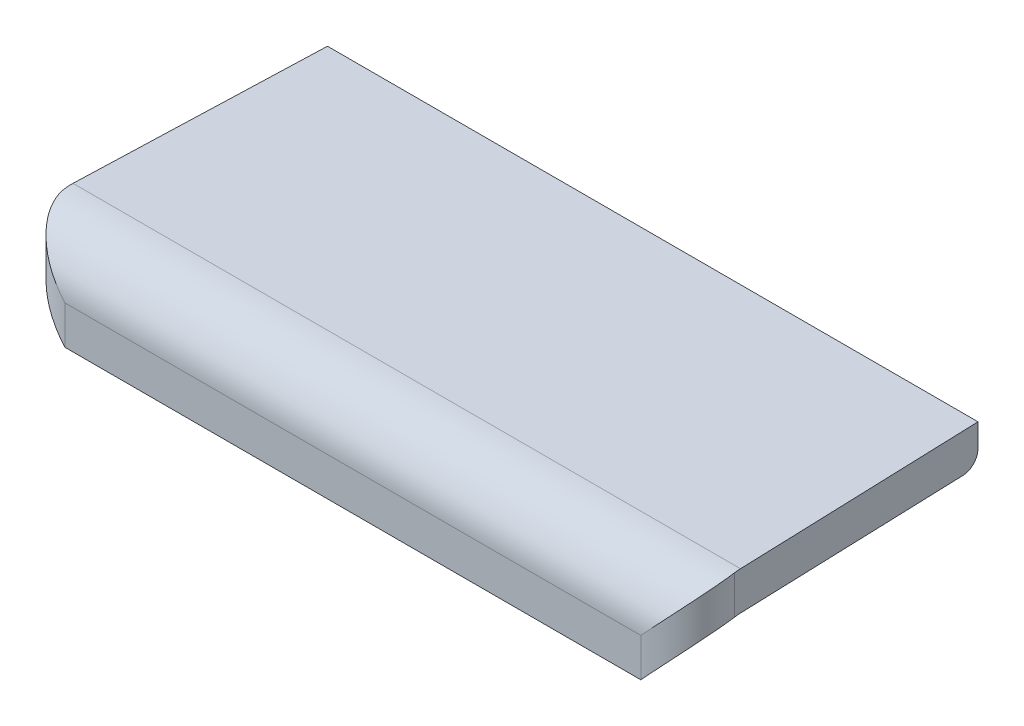
ISO-10303-21;
HEADER;
FILE_DESCRIPTION(('STEP AP214'),'2;1');
FILE_NAME('part.step','',(''),(''),'','','');
FILE_SCHEMA(('AUTOMOTIVE_DESIGN { 1 0 10303 214 1 1 1 1 }'));
ENDSEC;
DATA;
#1=APPLICATION_CONTEXT('core data for automotive mechanical design processes');
#2=APPLICATION_PROTOCOL_DEFINITION('international standard','automotive_design',2000,#1);
#3=PRODUCT_CONTEXT('',#1,'mechanical');
#4=PRODUCT('Part','Part','',(#3));
#5=PRODUCT_RELATED_PRODUCT_CATEGORY('part','',(#4));
#6=PRODUCT_DEFINITION_FORMATION('','',#4);
#7=PRODUCT_DEFINITION_CONTEXT('part definition',#1,'design');
#8=PRODUCT_DEFINITION('design','',#6,#7);
#9=PRODUCT_DEFINITION_SHAPE('','',#8);
#10=(LENGTH_UNIT() NAMED_UNIT(*) SI_UNIT(.MILLI.,.METRE.));
#11=(NAMED_UNIT(*) PLANE_ANGLE_UNIT() SI_UNIT($,.RADIAN.));
#12=(NAMED_UNIT(*) SI_UNIT($,.STERADIAN.) SOLID_ANGLE_UNIT());
#13=UNCERTAINTY_MEASURE_WITH_UNIT(LENGTH_MEASURE(1.E-05),#10,'distance_accuracy_value','');
#14=(GEOMETRIC_REPRESENTATION_CONTEXT(3) GLOBAL_UNCERTAINTY_ASSIGNED_CONTEXT((#13)) GLOBAL_UNIT_ASSIGNED_CONTEXT((#10,
#11,#12)) REPRESENTATION_CONTEXT('',''));
#15=CARTESIAN_POINT('',(0.,0.,0.));
#16=DIRECTION('',(0.,0.,1.));
#17=DIRECTION('',(1.,0.,0.));
#18=AXIS2_PLACEMENT_3D('',#15,#16,#17);
#19=CARTESIAN_POINT('',(22.,-2.5,49.5));
#20=DIRECTION('',(0.,1.,0.));
#21=DIRECTION('',(0.,0.,1.));
#22=AXIS2_PLACEMENT_3D('',#19,#20,#21);
#23=PLANE('',#22);
#24=DIRECTION('',(-0.0344622758397788,0.,0.999405999353588));
#25=VECTOR('',#24,1.);
#26=CARTESIAN_POINT('',(-21.6549881235154,-2.5,47.9946555819477));
#27=LINE('',#26,#25);
#28=CARTESIAN_POINT('',(-21.1896551724138,-2.5,34.5));
#29=VERTEX_POINT('',#28);
#30=CARTESIAN_POINT('',(-21.7068965517241,-2.5,49.5));
#31=VERTEX_POINT('',#30);
#32=EDGE_CURVE('E239',#29,#31,#27,.T.);
#33=ORIENTED_EDGE('',*,*,#32,.F.);
#34=DIRECTION('',(-1.,0.,0.));
#35=VECTOR('',#34,1.);
#36=CARTESIAN_POINT('',(21.1551724137931,-2.5,34.5));
#37=LINE('',#36,#35);
#38=CARTESIAN_POINT('',(21.1896551724138,-2.5,34.5));
#39=VERTEX_POINT('',#38);
#40=EDGE_CURVE('E47',#29,#39,#37,.F.);
#41=ORIENTED_EDGE('',*,*,#40,.T.);
#42=DIRECTION('',(-0.0344622758397784,0.,-0.999405999353588));
#43=VECTOR('',#42,1.);
#44=CARTESIAN_POINT('',(21.7072446555819,-2.5,49.5100950118765));
#45=LINE('',#44,#43);
#46=CARTESIAN_POINT('',(21.7068965517241,-2.5,49.5));
#47=VERTEX_POINT('',#46);
#48=EDGE_CURVE('E235',#47,#39,#45,.T.);
#49=ORIENTED_EDGE('',*,*,#48,.F.);
#50=DIRECTION('',(-1.,0.,0.));
#51=VECTOR('',#50,1.);
#52=CARTESIAN_POINT('',(22.,-2.5,49.5));
#53=LINE('',#52,#51);
#54=EDGE_CURVE('E311',#47,#31,#53,.T.);
#55=ORIENTED_EDGE('',*,*,#54,.T.);
#56=EDGE_LOOP('',(#33,#41,#49,#55));
#57=FACE_BOUND('',#56,.T.);
#58=DIRECTION('',(-1.,0.,0.));
#59=VECTOR('',#58,1.);
#60=CARTESIAN_POINT('',(10.,-2.5,41.));
#61=LINE('',#60,#59);
#62=CARTESIAN_POINT('',(10.,-2.5,41.));
#63=VERTEX_POINT('',#62);
#64=CARTESIAN_POINT('',(-10.,-2.5,41.));
#65=VERTEX_POINT('',#64);
#66=EDGE_CURVE('E59',#63,#65,#61,.T.);
#67=ORIENTED_EDGE('',*,*,#66,.T.);
#68=DIRECTION('',(0.,0.,1.));
#69=VECTOR('',#68,1.);
#70=CARTESIAN_POINT('',(-10.,-2.5,47.));
#71=LINE('',#70,#69);
#72=CARTESIAN_POINT('',(-10.,-2.5,47.));
#73=VERTEX_POINT('',#72);
#74=EDGE_CURVE('E409',#65,#73,#71,.T.);
#75=ORIENTED_EDGE('',*,*,#74,.T.);
#76=DIRECTION('',(-1.,0.,0.));
#77=VECTOR('',#76,1.);
#78=CARTESIAN_POINT('',(10.,-2.5,47.));
#79=LINE('',#78,#77);
#80=CARTESIAN_POINT('',(10.,-2.5,47.));
#81=VERTEX_POINT('',#80);
#82=EDGE_CURVE('E158',#81,#73,#79,.T.);
#83=ORIENTED_EDGE('',*,*,#82,.F.);
#84=DIRECTION('',(0.,0.,1.));
#85=VECTOR('',#84,1.);
#86=CARTESIAN_POINT('',(10.,-2.5,47.));
#87=LINE('',#86,#85);
#88=EDGE_CURVE('E54',#63,#81,#87,.T.);
#89=ORIENTED_EDGE('',*,*,#88,.F.);
#90=EDGE_LOOP('',(#67,#75,#83,#89));
#91=FACE_BOUND('',#90,.T.);
#92=ADVANCED_FACE('F39',(#57,#91),#23,.F.);
#93=CARTESIAN_POINT('',(22.,0.,49.5));
#94=DIRECTION('',(0.,-1.,0.));
#95=DIRECTION('',(0.,0.,-1.));
#96=AXIS2_PLACEMENT_3D('',#93,#94,#95);
#97=PLANE('',#96);
#98=DIRECTION('',(-0.0344622758397788,0.,0.999405999353588));
#99=VECTOR('',#98,1.);
#100=CARTESIAN_POINT('',(-21.1551724137931,0.,33.5));
#101=LINE('',#100,#99);
#102=CARTESIAN_POINT('',(-21.1551724137931,0.,33.5));
#103=VERTEX_POINT('',#102);
#104=CARTESIAN_POINT('',(-21.7068965517241,0.,49.5));
#105=VERTEX_POINT('',#104);
#106=EDGE_CURVE('E153',#103,#105,#101,.T.);
#107=ORIENTED_EDGE('',*,*,#106,.T.);
#108=DIRECTION('',(-1.,0.,0.));
#109=VECTOR('',#108,1.);
#110=CARTESIAN_POINT('',(22.,0.,49.5));
#111=LINE('',#110,#109);
#112=CARTESIAN_POINT('',(21.7068965517241,0.,49.5));
#113=VERTEX_POINT('',#112);
#114=EDGE_CURVE('E227',#113,#105,#111,.T.);
#115=ORIENTED_EDGE('',*,*,#114,.F.);
#116=DIRECTION('',(-0.0344622758397783,0.,-0.999405999353587));
#117=VECTOR('',#116,1.);
#118=CARTESIAN_POINT('',(21.1551724137931,0.,33.5));
#119=LINE('',#118,#117);
#120=CARTESIAN_POINT('',(21.1551724137931,0.,33.5));
#121=VERTEX_POINT('',#120);
#122=EDGE_CURVE('E156',#113,#121,#119,.T.);
#123=ORIENTED_EDGE('',*,*,#122,.T.);
#124=DIRECTION('',(-1.,0.,0.));
#125=VECTOR('',#124,1.);
#126=CARTESIAN_POINT('',(21.1551724137931,0.,33.5));
#127=LINE('',#126,#125);
#128=EDGE_CURVE('E164',#121,#103,#127,.T.);
#129=ORIENTED_EDGE('',*,*,#128,.T.);
#130=EDGE_LOOP('',(#107,#115,#123,#129));
#131=FACE_BOUND('',#130,.T.);
#132=ADVANCED_FACE('F213',(#131),#97,.F.);
#133=CARTESIAN_POINT('',(22.,-3.5,49.5));
#134=DIRECTION('',(-1.,0.,0.));
#135=DIRECTION('',(0.,0.,1.));
#136=AXIS2_PLACEMENT_3D('',#133,#134,#135);
#137=CYLINDRICAL_SURFACE('',#136,3.5);
#138=CARTESIAN_POINT('',(21.7068965517241,-3.5,49.5));
#139=DIRECTION('',(0.999405999353587,0.,-0.0344622758397783));
#140=DIRECTION('',(-0.0344622758397784,0.,-0.999405999353588));
#141=AXIS2_PLACEMENT_3D('',#138,#139,#140);
#142=ELLIPSE('',#141,3.50208023792511,3.5);
#143=CARTESIAN_POINT('',(21.7205728680166,-0.0225443221494809,49.8966131724806));
#144=VERTEX_POINT('',#143);
#145=EDGE_CURVE('E184',#113,#144,#142,.T.);
#146=ORIENTED_EDGE('',*,*,#145,.F.);
#147=ORIENTED_EDGE('',*,*,#114,.T.);
#148=CARTESIAN_POINT('',(-21.7068965517241,-3.5,49.5));
#149=DIRECTION('',(-0.999405999353588,0.,-0.0344622758397788));
#150=DIRECTION('',(-0.0344622758397788,0.,0.999405999353588));
#151=AXIS2_PLACEMENT_3D('',#148,#149,#150);
#152=ELLIPSE('',#151,3.50208023792511,3.5);
#153=CARTESIAN_POINT('',(-21.7205728680166,-0.0225443221494809,49.8966131724806));
#154=VERTEX_POINT('',#153);
#155=EDGE_CURVE('E188',#154,#105,#152,.T.);
#156=ORIENTED_EDGE('',*,*,#155,.F.);
#157=CARTESIAN_POINT('',(-21.7205728680166,-0.02254432214948,49.8966131724806));
#158=CARTESIAN_POINT('',(-21.723099481034,-0.0308270597133825,49.969397073666));
#159=CARTESIAN_POINT('',(-21.7229330313787,-0.0414387192479934,50.041987850838));
#160=CARTESIAN_POINT('',(-21.7174394702517,-0.0671333761220668,50.1861088489311));
#161=CARTESIAN_POINT('',(-21.7121171874432,-0.0822121806130926,50.2576399986027));
#162=CARTESIAN_POINT('',(-21.6966091949185,-0.116520602392555,50.3984893759646));
#163=CARTESIAN_POINT('',(-21.6864662803325,-0.135712894634143,50.4678214575865));
#164=CARTESIAN_POINT('',(-21.661655743448,-0.178049488283337,50.6044301030989));
#165=CARTESIAN_POINT('',(-21.646987250324,-0.201194549911776,50.6717062686432));
#166=CARTESIAN_POINT('',(-21.5968349115689,-0.275927568086759,50.86934082527));
#167=CARTESIAN_POINT('',(-21.555129550973,-0.33297031202598,50.9961358180921));
#168=CARTESIAN_POINT('',(-21.4580603760784,-0.459018576141426,51.2381490307011));
#169=CARTESIAN_POINT('',(-21.4026638443881,-0.528052632424236,51.3533385753107));
#170=CARTESIAN_POINT('',(-21.2528586884497,-0.709752512866677,51.6216835421228));
#171=CARTESIAN_POINT('',(-21.1522613830579,-0.827823366149102,51.7677318255221));
#172=CARTESIAN_POINT('',(-20.9348601670666,-1.07807424786497,52.0333223695516));
#173=CARTESIAN_POINT('',(-20.8180229357625,-1.21028315240175,52.1528087864646));
#174=CARTESIAN_POINT('',(-20.6109347383381,-1.44211081639417,52.3336461236898));
#175=CARTESIAN_POINT('',(-20.5235409696902,-1.53926624250616,52.4015806718975));
#176=CARTESIAN_POINT('',(-20.3446055433532,-1.7371662512179,52.5259015111697));
#177=CARTESIAN_POINT('',(-20.253062142409,-1.83791233837881,52.5822828928154));
#178=CARTESIAN_POINT('',(-20.0668499652639,-2.04210009715241,52.6839502339347));
#179=CARTESIAN_POINT('',(-19.9721803089163,-2.14554252611969,52.7292330380376));
#180=CARTESIAN_POINT('',(-19.7805796142608,-2.35436331000505,52.8090793722104));
#181=CARTESIAN_POINT('',(-19.6836491987311,-2.4597411301139,52.8436458177092));
#182=CARTESIAN_POINT('',(-19.4453849311314,-2.7183221553345,52.9152650321936));
#183=CARTESIAN_POINT('',(-19.3031829147086,-2.87227322535515,52.9467857269257));
#184=CARTESIAN_POINT('',(-19.0174239625978,-3.1812858866879,52.9889370017869));
#185=CARTESIAN_POINT('',(-18.8738699166592,-3.3363449890341,52.9996049724396));
#186=CARTESIAN_POINT('',(-18.7277137537086,-3.49421174391062,52.9999964069314));
#187=CARTESIAN_POINT('',(-18.7250342954736,-3.49710588957766,52.9999999964529));
#188=CARTESIAN_POINT('',(-18.7223548699558,-3.5,53.));
#189=B_SPLINE_CURVE_WITH_KNOTS('',3,(#157,#158,#159,#160,#161,#162,#163,#164,#165,#166,#167,
#168,#169,#170,#171,#172,#173,#174,#175,#176,#177,#178,#179,#180,#181,#182,#183,#184,#185,#186,
#187,#188),.UNSPECIFIED.,.F.,.F.,(4,2,2,2,2,2,2,2,2,2,2,2,2,2,2,4),(0.,0.219774415698643,
0.439343201846454,0.656998174418557,0.874695054967472,1.30815197444715,1.74265490197855,
2.37828380269417,3.0152366711636,3.45654082170771,3.89803211353046,4.33964877790322,
4.78114519302685,5.41585364892529,6.04942297640999,6.0612551408771),.UNSPECIFIED.);
#190=CARTESIAN_POINT('',(-18.7223548699558,-3.5,53.));
#191=VERTEX_POINT('',#190);
#192=EDGE_CURVE('E190',#191,#154,#189,.F.);
#193=ORIENTED_EDGE('',*,*,#192,.F.);
#194=DIRECTION('',(-1.,0.,0.));
#195=VECTOR('',#194,1.);
#196=CARTESIAN_POINT('',(22.,-3.5,53.));
#197=LINE('',#196,#195);
#198=CARTESIAN_POINT('',(18.7223548699558,-3.5,53.));
#199=VERTEX_POINT('',#198);
#200=EDGE_CURVE('E236',#199,#191,#197,.T.);
#201=ORIENTED_EDGE('',*,*,#200,.F.);
#202=CARTESIAN_POINT('',(21.7205728680166,-0.02254432214948,49.8966131724806));
#203=CARTESIAN_POINT('',(21.723099481034,-0.0308270597133825,49.969397073666));
#204=CARTESIAN_POINT('',(21.7229330313787,-0.0414387192479934,50.041987850838));
#205=CARTESIAN_POINT('',(21.7174394702517,-0.0671333761220668,50.1861088489311));
#206=CARTESIAN_POINT('',(21.7121171874432,-0.0822121806130926,50.2576399986027));
#207=CARTESIAN_POINT('',(21.6966091949185,-0.116520602392555,50.3984893759646));
#208=CARTESIAN_POINT('',(21.6864662803325,-0.135712894634143,50.4678214575865));
#209=CARTESIAN_POINT('',(21.661655743448,-0.178049488283337,50.6044301030989));
#210=CARTESIAN_POINT('',(21.646987250324,-0.201194549911776,50.6717062686432));
#211=CARTESIAN_POINT('',(21.5968349115689,-0.275927568086759,50.86934082527));
#212=CARTESIAN_POINT('',(21.555129550973,-0.33297031202598,50.9961358180921));
#213=CARTESIAN_POINT('',(21.4580603760784,-0.459018576141426,51.2381490307011));
#214=CARTESIAN_POINT('',(21.4026638443881,-0.528052632424236,51.3533385753107));
#215=CARTESIAN_POINT('',(21.2528586884497,-0.709752512866677,51.6216835421228));
#216=CARTESIAN_POINT('',(21.1522613830579,-0.827823366149102,51.7677318255221));
#217=CARTESIAN_POINT('',(20.9348601670666,-1.07807424786497,52.0333223695516));
#218=CARTESIAN_POINT('',(20.8180229357625,-1.21028315240175,52.1528087864646));
#219=CARTESIAN_POINT('',(20.6109347383381,-1.44211081639417,52.3336461236898));
#220=CARTESIAN_POINT('',(20.5235409696902,-1.53926624250616,52.4015806718975));
#221=CARTESIAN_POINT('',(20.3446055433532,-1.7371662512179,52.5259015111697));
#222=CARTESIAN_POINT('',(20.253062142409,-1.83791233837881,52.5822828928154));
#223=CARTESIAN_POINT('',(20.0668499652639,-2.04210009715241,52.6839502339347));
#224=CARTESIAN_POINT('',(19.9721803089163,-2.14554252611969,52.7292330380376));
#225=CARTESIAN_POINT('',(19.7805796142608,-2.35436331000505,52.8090793722104));
#226=CARTESIAN_POINT('',(19.6836491987311,-2.4597411301139,52.8436458177092));
#227=CARTESIAN_POINT('',(19.4453849311314,-2.7183221553345,52.9152650321936));
#228=CARTESIAN_POINT('',(19.3031829147086,-2.87227322535515,52.9467857269257));
#229=CARTESIAN_POINT('',(19.0174239625978,-3.1812858866879,52.9889370017869));
#230=CARTESIAN_POINT('',(18.8738699166592,-3.3363449890341,52.9996049724396));
#231=CARTESIAN_POINT('',(18.7277137537086,-3.49421174391062,52.9999964069314));
#232=CARTESIAN_POINT('',(18.7250342954736,-3.49710588957766,52.9999999964529));
#233=CARTESIAN_POINT('',(18.7223548699558,-3.5,53.));
#234=B_SPLINE_CURVE_WITH_KNOTS('',3,(#202,#203,#204,#205,#206,#207,#208,#209,#210,#211,#212,
#213,#214,#215,#216,#217,#218,#219,#220,#221,#222,#223,#224,#225,#226,#227,#228,#229,#230,#231,
#232,#233),.UNSPECIFIED.,.F.,.F.,(4,2,2,2,2,2,2,2,2,2,2,2,2,2,2,4),(0.,0.219774415698643,
0.439343201846454,0.656998174418557,0.874695054967472,1.30815197444715,1.74265490197855,
2.37828380269417,3.0152366711636,3.45654082170771,3.89803211353046,4.33964877790322,
4.78114519302685,5.41585364892529,6.04942297640999,6.0612551408771),.UNSPECIFIED.);
#235=EDGE_CURVE('E198',#144,#199,#234,.T.);
#236=ORIENTED_EDGE('',*,*,#235,.F.);
#237=EDGE_LOOP('',(#146,#147,#156,#193,#201,#236));
#238=FACE_BOUND('',#237,.T.);
#239=ADVANCED_FACE('F208',(#238),#137,.T.);
#240=CARTESIAN_POINT('',(22.,-6.,53.));
#241=DIRECTION('',(0.,0.,-1.));
#242=DIRECTION('',(-1.,0.,0.));
#243=AXIS2_PLACEMENT_3D('',#240,#241,#242);
#244=PLANE('',#243);
#245=DIRECTION('',(-1.,0.,0.));
#246=VECTOR('',#245,1.);
#247=CARTESIAN_POINT('',(22.,-6.,53.));
#248=LINE('',#247,#246);
#249=CARTESIAN_POINT('',(18.7223548699558,-6.,53.));
#250=VERTEX_POINT('',#249);
#251=CARTESIAN_POINT('',(-18.7223548699558,-6.,53.));
#252=VERTEX_POINT('',#251);
#253=EDGE_CURVE('E242',#250,#252,#248,.T.);
#254=ORIENTED_EDGE('',*,*,#253,.F.);
#255=DIRECTION('',(0.,1.,0.));
#256=VECTOR('',#255,1.);
#257=CARTESIAN_POINT('',(18.7223548699558,-7.,53.));
#258=LINE('',#257,#256);
#259=EDGE_CURVE('E176',#250,#199,#258,.T.);
#260=ORIENTED_EDGE('',*,*,#259,.T.);
#261=ORIENTED_EDGE('',*,*,#200,.T.);
#262=DIRECTION('',(0.,1.,0.));
#263=VECTOR('',#262,1.);
#264=CARTESIAN_POINT('',(-18.7223548699558,-7.,53.));
#265=LINE('',#264,#263);
#266=EDGE_CURVE('E179',#252,#191,#265,.T.);
#267=ORIENTED_EDGE('',*,*,#266,.F.);
#268=EDGE_LOOP('',(#254,#260,#261,#267));
#269=FACE_BOUND('',#268,.T.);
#270=ADVANCED_FACE('F212',(#269),#244,.F.);
#271=CARTESIAN_POINT('',(22.,-6.,49.5));
#272=DIRECTION('',(-1.,0.,0.));
#273=DIRECTION('',(0.,0.,1.));
#274=AXIS2_PLACEMENT_3D('',#271,#272,#273);
#275=CYLINDRICAL_SURFACE('',#274,3.5);
#276=CARTESIAN_POINT('',(21.7068965517241,-6.,49.5));
#277=DIRECTION('',(0.999405999353587,0.,-0.0344622758397783));
#278=DIRECTION('',(-0.0344622758397784,0.,-0.999405999353588));
#279=AXIS2_PLACEMENT_3D('',#276,#277,#278);
#280=ELLIPSE('',#279,3.50208023792511,3.5);
#281=CARTESIAN_POINT('',(21.7205728680166,-2.52254432214948,49.8966131724806));
#282=VERTEX_POINT('',#281);
#283=EDGE_CURVE('E170',#282,#47,#280,.F.);
#284=ORIENTED_EDGE('',*,*,#283,.F.);
#285=CARTESIAN_POINT('',(21.7205728680166,-2.52254432214948,49.8966131724806));
#286=CARTESIAN_POINT('',(21.723099481034,-2.53082705971338,49.969397073666));
#287=CARTESIAN_POINT('',(21.7229330313787,-2.54143871924799,50.041987850838));
#288=CARTESIAN_POINT('',(21.7174394702517,-2.56713337612207,50.1861088489311));
#289=CARTESIAN_POINT('',(21.7121171874432,-2.58221218061309,50.2576399986027));
#290=CARTESIAN_POINT('',(21.6966091949185,-2.61652060239256,50.3984893759646));
#291=CARTESIAN_POINT('',(21.6864662803325,-2.63571289463414,50.4678214575865));
#292=CARTESIAN_POINT('',(21.661655743448,-2.67804948828334,50.6044301030989));
#293=CARTESIAN_POINT('',(21.646987250324,-2.70119454991178,50.6717062686432));
#294=CARTESIAN_POINT('',(21.5968349115689,-2.77592756808676,50.86934082527));
#295=CARTESIAN_POINT('',(21.555129550973,-2.83297031202598,50.9961358180921));
#296=CARTESIAN_POINT('',(21.4580603760784,-2.95901857614142,51.2381490307011));
#297=CARTESIAN_POINT('',(21.4026638443881,-3.02805263242423,51.3533385753107));
#298=CARTESIAN_POINT('',(21.2528586884497,-3.20975251286668,51.6216835421228));
#299=CARTESIAN_POINT('',(21.1522613830579,-3.32782336614911,51.7677318255221));
#300=CARTESIAN_POINT('',(20.9348601670666,-3.57807424786498,52.0333223695517));
#301=CARTESIAN_POINT('',(20.8180229357625,-3.71028315240176,52.1528087864646));
#302=CARTESIAN_POINT('',(20.6109347383381,-3.94211081639419,52.3336461236898));
#303=CARTESIAN_POINT('',(20.5235409696901,-4.03926624250617,52.4015806718975));
#304=CARTESIAN_POINT('',(20.3446055433532,-4.23716625121791,52.5259015111697));
#305=CARTESIAN_POINT('',(20.253062142409,-4.33791233837883,52.5822828928154));
#306=CARTESIAN_POINT('',(20.0668499652639,-4.54210009715242,52.6839502339347));
#307=CARTESIAN_POINT('',(19.9721803089163,-4.6455425261197,52.7292330380376));
#308=CARTESIAN_POINT('',(19.7805796142608,-4.85436331000506,52.8090793722104));
#309=CARTESIAN_POINT('',(19.6836491987311,-4.95974113011392,52.8436458177092));
#310=CARTESIAN_POINT('',(19.4453849311314,-5.21832215533451,52.9152650321936));
#311=CARTESIAN_POINT('',(19.3031829147086,-5.37227322535518,52.9467857269257));
#312=CARTESIAN_POINT('',(19.0174239625978,-5.68128588668789,52.9889370017869));
#313=CARTESIAN_POINT('',(18.8738699166591,-5.83634498903405,52.9996049724396));
#314=CARTESIAN_POINT('',(18.7277137537086,-5.99421174391062,52.9999964069314));
#315=CARTESIAN_POINT('',(18.7250342954736,-5.99710588957766,52.9999999964529));
#316=CARTESIAN_POINT('',(18.7223548699558,-6.,53.));
#317=B_SPLINE_CURVE_WITH_KNOTS('',3,(#285,#286,#287,#288,#289,#290,#291,#292,#293,#294,#295,
#296,#297,#298,#299,#300,#301,#302,#303,#304,#305,#306,#307,#308,#309,#310,#311,#312,#313,#314,
#315,#316),.UNSPECIFIED.,.F.,.F.,(4,2,2,2,2,2,2,2,2,2,2,2,2,2,2,4),(0.,0.219774415698643,
0.439343201846454,0.656998174418557,0.874695054967472,1.30815197444714,1.74265490197855,
2.37828380269418,3.01523667116362,3.45654082170773,3.89803211353048,4.33964877790324,
4.78114519302687,5.4158536489253,6.04942297640999,6.0612551408771),.UNSPECIFIED.);
#318=EDGE_CURVE('E253',#250,#282,#317,.F.);
#319=ORIENTED_EDGE('',*,*,#318,.F.);
#320=ORIENTED_EDGE('',*,*,#253,.T.);
#321=CARTESIAN_POINT('',(-21.7205728680166,-2.52254432214948,49.8966131724806));
#322=CARTESIAN_POINT('',(-21.723099481034,-2.53082705971338,49.969397073666));
#323=CARTESIAN_POINT('',(-21.7229330313787,-2.54143871924799,50.041987850838));
#324=CARTESIAN_POINT('',(-21.7174394702517,-2.56713337612207,50.1861088489311));
#325=CARTESIAN_POINT('',(-21.7121171874432,-2.58221218061309,50.2576399986027));
#326=CARTESIAN_POINT('',(-21.6966091949185,-2.61652060239256,50.3984893759646));
#327=CARTESIAN_POINT('',(-21.6864662803325,-2.63571289463414,50.4678214575865));
#328=CARTESIAN_POINT('',(-21.661655743448,-2.67804948828334,50.6044301030989));
#329=CARTESIAN_POINT('',(-21.646987250324,-2.70119454991178,50.6717062686432));
#330=CARTESIAN_POINT('',(-21.5968349115689,-2.77592756808676,50.86934082527));
#331=CARTESIAN_POINT('',(-21.555129550973,-2.83297031202598,50.9961358180921));
#332=CARTESIAN_POINT('',(-21.4580603760784,-2.95901857614142,51.2381490307011));
#333=CARTESIAN_POINT('',(-21.4026638443881,-3.02805263242423,51.3533385753107));
#334=CARTESIAN_POINT('',(-21.2528586884497,-3.20975251286668,51.6216835421228));
#335=CARTESIAN_POINT('',(-21.1522613830579,-3.32782336614911,51.7677318255221));
#336=CARTESIAN_POINT('',(-20.9348601670666,-3.57807424786498,52.0333223695517));
#337=CARTESIAN_POINT('',(-20.8180229357625,-3.71028315240176,52.1528087864646));
#338=CARTESIAN_POINT('',(-20.6109347383381,-3.94211081639419,52.3336461236898));
#339=CARTESIAN_POINT('',(-20.5235409696901,-4.03926624250617,52.4015806718975));
#340=CARTESIAN_POINT('',(-20.3446055433532,-4.23716625121791,52.5259015111697));
#341=CARTESIAN_POINT('',(-20.253062142409,-4.33791233837883,52.5822828928154));
#342=CARTESIAN_POINT('',(-20.0668499652639,-4.54210009715242,52.6839502339347));
#343=CARTESIAN_POINT('',(-19.9721803089163,-4.6455425261197,52.7292330380376));
#344=CARTESIAN_POINT('',(-19.7805796142608,-4.85436331000506,52.8090793722104));
#345=CARTESIAN_POINT('',(-19.6836491987311,-4.95974113011392,52.8436458177092));
#346=CARTESIAN_POINT('',(-19.4453849311314,-5.21832215533451,52.9152650321936));
#347=CARTESIAN_POINT('',(-19.3031829147086,-5.37227322535518,52.9467857269257));
#348=CARTESIAN_POINT('',(-19.0174239625978,-5.68128588668789,52.9889370017869));
#349=CARTESIAN_POINT('',(-18.8738699166591,-5.83634498903405,52.9996049724396));
#350=CARTESIAN_POINT('',(-18.7277137537086,-5.99421174391062,52.9999964069314));
#351=CARTESIAN_POINT('',(-18.7250342954736,-5.99710588957766,52.9999999964529));
#352=CARTESIAN_POINT('',(-18.7223548699558,-6.,53.));
#353=B_SPLINE_CURVE_WITH_KNOTS('',3,(#321,#322,#323,#324,#325,#326,#327,#328,#329,#330,#331,
#332,#333,#334,#335,#336,#337,#338,#339,#340,#341,#342,#343,#344,#345,#346,#347,#348,#349,#350,
#351,#352),.UNSPECIFIED.,.F.,.F.,(4,2,2,2,2,2,2,2,2,2,2,2,2,2,2,4),(0.,0.219774415698643,
0.439343201846454,0.656998174418557,0.874695054967472,1.30815197444714,1.74265490197855,
2.37828380269418,3.01523667116362,3.45654082170773,3.89803211353048,4.33964877790324,
4.78114519302687,5.4158536489253,6.04942297640999,6.0612551408771),.UNSPECIFIED.);
#354=CARTESIAN_POINT('',(-21.7205728680166,-2.52254432214948,49.8966131724806));
#355=VERTEX_POINT('',#354);
#356=EDGE_CURVE('E247',#355,#252,#353,.T.);
#357=ORIENTED_EDGE('',*,*,#356,.F.);
#358=CARTESIAN_POINT('',(-21.7068965517241,-6.,49.5));
#359=DIRECTION('',(-0.999405999353588,0.,-0.0344622758397788));
#360=DIRECTION('',(-0.0344622758397788,0.,0.999405999353588));
#361=AXIS2_PLACEMENT_3D('',#358,#359,#360);
#362=ELLIPSE('',#361,3.50208023792511,3.5);
#363=EDGE_CURVE('E186',#31,#355,#362,.F.);
#364=ORIENTED_EDGE('',*,*,#363,.F.);
#365=ORIENTED_EDGE('',*,*,#54,.F.);
#366=EDGE_LOOP('',(#284,#319,#320,#357,#364,#365));
#367=FACE_BOUND('',#366,.T.);
#368=ADVANCED_FACE('F259',(#367),#275,.F.);
#369=CARTESIAN_POINT('',(18.7223548699558,-7.,50.));
#370=DIRECTION('',(0.,1.,0.));
#371=DIRECTION('',(0.,0.,1.));
#372=AXIS2_PLACEMENT_3D('',#369,#370,#371);
#373=CYLINDRICAL_SURFACE('',#372,3.);
#374=ORIENTED_EDGE('',*,*,#235,.T.);
#375=ORIENTED_EDGE('',*,*,#259,.F.);
#376=ORIENTED_EDGE('',*,*,#318,.T.);
#377=DIRECTION('',(0.,1.,0.));
#378=VECTOR('',#377,1.);
#379=CARTESIAN_POINT('',(21.7205728680166,-7.,49.8966131724806));
#380=LINE('',#379,#378);
#381=EDGE_CURVE('E173',#282,#144,#380,.T.);
#382=ORIENTED_EDGE('',*,*,#381,.T.);
#383=EDGE_LOOP('',(#374,#375,#376,#382));
#384=FACE_BOUND('',#383,.T.);
#385=ADVANCED_FACE('F262',(#384),#373,.T.);
#386=CARTESIAN_POINT('',(-18.7223548699558,-7.,50.));
#387=DIRECTION('',(0.,1.,0.));
#388=DIRECTION('',(0.,0.,1.));
#389=AXIS2_PLACEMENT_3D('',#386,#387,#388);
#390=CYLINDRICAL_SURFACE('',#389,3.);
#391=ORIENTED_EDGE('',*,*,#192,.T.);
#392=DIRECTION('',(0.,1.,0.));
#393=VECTOR('',#392,1.);
#394=CARTESIAN_POINT('',(-21.7205728680166,-7.,49.8966131724806));
#395=LINE('',#394,#393);
#396=EDGE_CURVE('E167',#355,#154,#395,.T.);
#397=ORIENTED_EDGE('',*,*,#396,.F.);
#398=ORIENTED_EDGE('',*,*,#356,.T.);
#399=ORIENTED_EDGE('',*,*,#266,.T.);
#400=EDGE_LOOP('',(#391,#397,#398,#399));
#401=FACE_BOUND('',#400,.T.);
#402=ADVANCED_FACE('F205',(#401),#390,.T.);
#403=CARTESIAN_POINT('',(-21.1551724137931,-7.,33.5));
#404=DIRECTION('',(-0.999405999353588,0.,-0.0344622758397788));
#405=DIRECTION('',(-0.0344622758397788,0.,0.999405999353588));
#406=AXIS2_PLACEMENT_3D('',#403,#404,#405);
#407=PLANE('',#406);
#408=DIRECTION('',(0.,1.,0.));
#409=VECTOR('',#408,1.);
#410=CARTESIAN_POINT('',(-21.1551724137931,-7.,33.5));
#411=LINE('',#410,#409);
#412=CARTESIAN_POINT('',(-21.1551724137931,-1.5,33.5));
#413=VERTEX_POINT('',#412);
#414=EDGE_CURVE('E168',#413,#103,#411,.T.);
#415=ORIENTED_EDGE('',*,*,#414,.F.);
#416=CARTESIAN_POINT('',(-21.1896551724138,-1.5,34.5));
#417=DIRECTION('',(-0.999405999353588,0.,-0.0344622758397788));
#418=DIRECTION('',(0.0344622758397788,0.,-0.999405999353588));
#419=AXIS2_PLACEMENT_3D('',#416,#417,#418);
#420=ELLIPSE('',#419,1.00059435369289,1.);
#421=EDGE_CURVE('E276',#413,#29,#420,.T.);
#422=ORIENTED_EDGE('',*,*,#421,.T.);
#423=ORIENTED_EDGE('',*,*,#32,.T.);
#424=ORIENTED_EDGE('',*,*,#363,.T.);
#425=ORIENTED_EDGE('',*,*,#396,.T.);
#426=ORIENTED_EDGE('',*,*,#155,.T.);
#427=ORIENTED_EDGE('',*,*,#106,.F.);
#428=EDGE_LOOP('',(#415,#422,#423,#424,#425,#426,#427));
#429=FACE_BOUND('',#428,.T.);
#430=ADVANCED_FACE('F265',(#429),#407,.T.);
#431=CARTESIAN_POINT('',(21.1551724137931,-7.,33.5));
#432=DIRECTION('',(0.,0.,-1.));
#433=DIRECTION('',(-1.,0.,0.));
#434=AXIS2_PLACEMENT_3D('',#431,#432,#433);
#435=PLANE('',#434);
#436=DIRECTION('',(0.,1.,0.));
#437=VECTOR('',#436,1.);
#438=CARTESIAN_POINT('',(21.1551724137931,-7.,33.5));
#439=LINE('',#438,#437);
#440=CARTESIAN_POINT('',(21.1551724137931,-1.5,33.5));
#441=VERTEX_POINT('',#440);
#442=EDGE_CURVE('E171',#441,#121,#439,.T.);
#443=ORIENTED_EDGE('',*,*,#442,.F.);
#444=DIRECTION('',(-1.,0.,0.));
#445=VECTOR('',#444,1.);
#446=CARTESIAN_POINT('',(-21.1551724137931,-1.5,33.5));
#447=LINE('',#446,#445);
#448=EDGE_CURVE('E281',#441,#413,#447,.T.);
#449=ORIENTED_EDGE('',*,*,#448,.T.);
#450=ORIENTED_EDGE('',*,*,#414,.T.);
#451=ORIENTED_EDGE('',*,*,#128,.F.);
#452=EDGE_LOOP('',(#443,#449,#450,#451));
#453=FACE_BOUND('',#452,.T.);
#454=ADVANCED_FACE('F267',(#453),#435,.T.);
#455=CARTESIAN_POINT('',(21.1551724137931,-7.,33.5));
#456=DIRECTION('',(0.999405999353587,0.,-0.0344622758397783));
#457=DIRECTION('',(-0.0344622758397784,0.,-0.999405999353588));
#458=AXIS2_PLACEMENT_3D('',#455,#456,#457);
#459=PLANE('',#458);
#460=ORIENTED_EDGE('',*,*,#48,.T.);
#461=CARTESIAN_POINT('',(21.1896551724138,-1.5,34.5));
#462=DIRECTION('',(0.999405999353587,0.,-0.0344622758397783));
#463=DIRECTION('',(0.0344622758397783,0.,0.999405999353588));
#464=AXIS2_PLACEMENT_3D('',#461,#462,#463);
#465=ELLIPSE('',#464,1.00059435369289,1.);
#466=EDGE_CURVE('E11',#39,#441,#465,.T.);
#467=ORIENTED_EDGE('',*,*,#466,.T.);
#468=ORIENTED_EDGE('',*,*,#442,.T.);
#469=ORIENTED_EDGE('',*,*,#122,.F.);
#470=ORIENTED_EDGE('',*,*,#145,.T.);
#471=ORIENTED_EDGE('',*,*,#381,.F.);
#472=ORIENTED_EDGE('',*,*,#283,.T.);
#473=EDGE_LOOP('',(#460,#467,#468,#469,#470,#471,#472));
#474=FACE_BOUND('',#473,.T.);
#475=ADVANCED_FACE('F272',(#474),#459,.T.);
#476=CARTESIAN_POINT('',(21.1551724137931,-1.5,34.5));
#477=DIRECTION('',(1.,0.,0.));
#478=DIRECTION('',(0.,0.,-1.));
#479=AXIS2_PLACEMENT_3D('',#476,#477,#478);
#480=CYLINDRICAL_SURFACE('',#479,1.);
#481=ORIENTED_EDGE('',*,*,#466,.F.);
#482=ORIENTED_EDGE('',*,*,#40,.F.);
#483=ORIENTED_EDGE('',*,*,#421,.F.);
#484=ORIENTED_EDGE('',*,*,#448,.F.);
#485=EDGE_LOOP('',(#481,#482,#483,#484));
#486=FACE_BOUND('',#485,.T.);
#487=ADVANCED_FACE('F41',(#486),#480,.T.);
#488=CARTESIAN_POINT('',(10.,-8.00000000000001,44.));
#489=DIRECTION('',(1.,0.,0.));
#490=DIRECTION('',(0.,0.,-1.));
#491=AXIS2_PLACEMENT_3D('',#488,#489,#490);
#492=PLANE('',#491);
#493=CARTESIAN_POINT('',(10.,-8.00000000000001,44.));
#494=DIRECTION('',(1.,0.,0.));
#495=DIRECTION('',(0.,0.,-1.));
#496=AXIS2_PLACEMENT_3D('',#493,#494,#495);
#497=CIRCLE('',#496,3.);
#498=CARTESIAN_POINT('',(10.,-8.00000000000001,47.));
#499=VERTEX_POINT('',#498);
#500=CARTESIAN_POINT('',(10.,-8.00000000000001,41.));
#501=VERTEX_POINT('',#500);
#502=EDGE_CURVE('E138',#499,#501,#497,.T.);
#503=ORIENTED_EDGE('',*,*,#502,.T.);
#504=DIRECTION('',(0.,1.,0.));
#505=VECTOR('',#504,1.);
#506=CARTESIAN_POINT('',(10.,-2.5,41.));
#507=LINE('',#506,#505);
#508=EDGE_CURVE('E131',#501,#63,#507,.T.);
#509=ORIENTED_EDGE('',*,*,#508,.T.);
#510=ORIENTED_EDGE('',*,*,#88,.T.);
#511=DIRECTION('',(0.,-1.,0.));
#512=VECTOR('',#511,1.);
#513=CARTESIAN_POINT('',(10.,-8.00000000000001,47.));
#514=LINE('',#513,#512);
#515=EDGE_CURVE('E144',#81,#499,#514,.T.);
#516=ORIENTED_EDGE('',*,*,#515,.T.);
#517=EDGE_LOOP('',(#503,#509,#510,#516));
#518=FACE_BOUND('',#517,.T.);
#519=CARTESIAN_POINT('',(10.,-8.00000000000001,44.));
#520=DIRECTION('',(1.,0.,0.));
#521=DIRECTION('',(0.,0.,-1.));
#522=AXIS2_PLACEMENT_3D('',#519,#520,#521);
#523=CIRCLE('',#522,2.);
#524=CARTESIAN_POINT('',(10.,-8.00000000000001,42.));
#525=VERTEX_POINT('',#524);
#526=EDGE_CURVE('E395',#525,#525,#523,.T.);
#527=ORIENTED_EDGE('',*,*,#526,.F.);
#528=EDGE_LOOP('',(#527));
#529=FACE_BOUND('',#528,.T.);
#530=ADVANCED_FACE('F141',(#518,#529),#492,.T.);
#531=CARTESIAN_POINT('',(-10.,-8.00000000000001,44.));
#532=DIRECTION('',(1.,0.,0.));
#533=DIRECTION('',(0.,0.,-1.));
#534=AXIS2_PLACEMENT_3D('',#531,#532,#533);
#535=PLANE('',#534);
#536=CARTESIAN_POINT('',(-10.,-8.00000000000001,44.));
#537=DIRECTION('',(1.,0.,0.));
#538=DIRECTION('',(0.,0.,-1.));
#539=AXIS2_PLACEMENT_3D('',#536,#537,#538);
#540=CIRCLE('',#539,3.);
#541=CARTESIAN_POINT('',(-10.,-8.00000000000001,47.));
#542=VERTEX_POINT('',#541);
#543=CARTESIAN_POINT('',(-10.,-8.00000000000001,41.));
#544=VERTEX_POINT('',#543);
#545=EDGE_CURVE('E152',#542,#544,#540,.T.);
#546=ORIENTED_EDGE('',*,*,#545,.F.);
#547=DIRECTION('',(0.,-1.,0.));
#548=VECTOR('',#547,1.);
#549=CARTESIAN_POINT('',(-10.,-8.00000000000001,47.));
#550=LINE('',#549,#548);
#551=EDGE_CURVE('E148',#73,#542,#550,.T.);
#552=ORIENTED_EDGE('',*,*,#551,.F.);
#553=ORIENTED_EDGE('',*,*,#74,.F.);
#554=DIRECTION('',(0.,1.,0.));
#555=VECTOR('',#554,1.);
#556=CARTESIAN_POINT('',(-10.,-2.5,41.));
#557=LINE('',#556,#555);
#558=EDGE_CURVE('E407',#544,#65,#557,.T.);
#559=ORIENTED_EDGE('',*,*,#558,.F.);
#560=EDGE_LOOP('',(#546,#552,#553,#559));
#561=FACE_BOUND('',#560,.T.);
#562=CARTESIAN_POINT('',(-10.,-8.00000000000001,44.));
#563=DIRECTION('',(1.,0.,0.));
#564=DIRECTION('',(0.,0.,-1.));
#565=AXIS2_PLACEMENT_3D('',#562,#563,#564);
#566=CIRCLE('',#565,2.);
#567=CARTESIAN_POINT('',(-10.,-8.00000000000001,42.));
#568=VERTEX_POINT('',#567);
#569=EDGE_CURVE('E398',#568,#568,#566,.T.);
#570=ORIENTED_EDGE('',*,*,#569,.T.);
#571=EDGE_LOOP('',(#570));
#572=FACE_BOUND('',#571,.T.);
#573=ADVANCED_FACE('F297',(#561,#572),#535,.F.);
#574=CARTESIAN_POINT('',(10.,-8.00000000000001,44.));
#575=DIRECTION('',(-1.,0.,0.));
#576=DIRECTION('',(0.,0.,1.));
#577=AXIS2_PLACEMENT_3D('',#574,#575,#576);
#578=CYLINDRICAL_SURFACE('',#577,3.);
#579=ORIENTED_EDGE('',*,*,#545,.T.);
#580=DIRECTION('',(-1.,0.,0.));
#581=VECTOR('',#580,1.);
#582=CARTESIAN_POINT('',(10.,-8.00000000000001,41.));
#583=LINE('',#582,#581);
#584=EDGE_CURVE('E135',#501,#544,#583,.T.);
#585=ORIENTED_EDGE('',*,*,#584,.F.);
#586=ORIENTED_EDGE('',*,*,#502,.F.);
#587=DIRECTION('',(-1.,0.,0.));
#588=VECTOR('',#587,1.);
#589=CARTESIAN_POINT('',(10.,-8.00000000000001,47.));
#590=LINE('',#589,#588);
#591=EDGE_CURVE('E405',#499,#542,#590,.T.);
#592=ORIENTED_EDGE('',*,*,#591,.T.);
#593=EDGE_LOOP('',(#579,#585,#586,#592));
#594=FACE_BOUND('',#593,.T.);
#595=ADVANCED_FACE('F150',(#594),#578,.T.);
#596=CARTESIAN_POINT('',(10.,-2.5,41.));
#597=DIRECTION('',(0.,0.,1.));
#598=DIRECTION('',(0.,-1.,0.));
#599=AXIS2_PLACEMENT_3D('',#596,#597,#598);
#600=PLANE('',#599);
#601=ORIENTED_EDGE('',*,*,#558,.T.);
#602=ORIENTED_EDGE('',*,*,#66,.F.);
#603=ORIENTED_EDGE('',*,*,#508,.F.);
#604=ORIENTED_EDGE('',*,*,#584,.T.);
#605=EDGE_LOOP('',(#601,#602,#603,#604));
#606=FACE_BOUND('',#605,.T.);
#607=ADVANCED_FACE('F133',(#606),#600,.F.);
#608=CARTESIAN_POINT('',(10.,-8.00000000000001,47.));
#609=DIRECTION('',(0.,0.,-1.));
#610=DIRECTION('',(-1.,0.,0.));
#611=AXIS2_PLACEMENT_3D('',#608,#609,#610);
#612=PLANE('',#611);
#613=ORIENTED_EDGE('',*,*,#551,.T.);
#614=ORIENTED_EDGE('',*,*,#591,.F.);
#615=ORIENTED_EDGE('',*,*,#515,.F.);
#616=ORIENTED_EDGE('',*,*,#82,.T.);
#617=EDGE_LOOP('',(#613,#614,#615,#616));
#618=FACE_BOUND('',#617,.T.);
#619=ADVANCED_FACE('F375',(#618),#612,.F.);
#620=CARTESIAN_POINT('',(10.,-8.00000000000001,44.));
#621=DIRECTION('',(-1.,0.,0.));
#622=DIRECTION('',(0.,0.,1.));
#623=AXIS2_PLACEMENT_3D('',#620,#621,#622);
#624=CYLINDRICAL_SURFACE('',#623,2.);
#625=ORIENTED_EDGE('',*,*,#526,.T.);
#626=EDGE_LOOP('',(#625));
#627=FACE_BOUND('',#626,.T.);
#628=ORIENTED_EDGE('',*,*,#569,.F.);
#629=EDGE_LOOP('',(#628));
#630=FACE_BOUND('',#629,.T.);
#631=ADVANCED_FACE('F382',(#627,#630),#624,.F.);
#632=CLOSED_SHELL('',(#92,#132,#239,#270,#368,#385,#402,#430,#454,#475,#487,#530,#573,#595,#607,
#619,#631));
#633=MANIFOLD_SOLID_BREP('B2',#632);
#634=ADVANCED_BREP_SHAPE_REPRESENTATION('',(#18,#633),#14);
#635=SHAPE_DEFINITION_REPRESENTATION(#9,#634);
ENDSEC;
END-ISO-10303-21;
